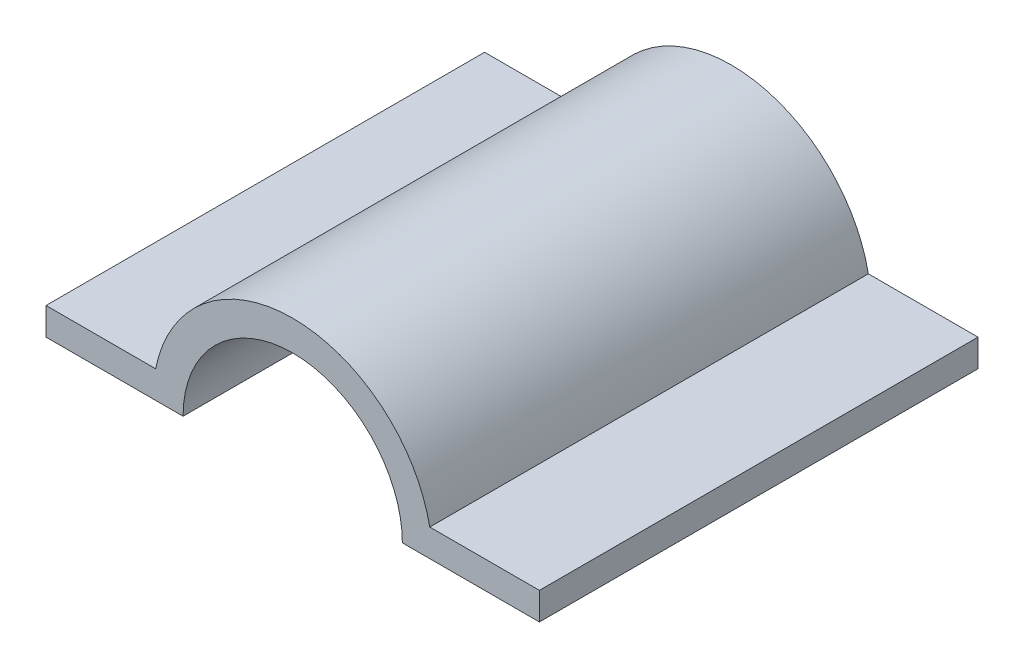
ISO-10303-21;
HEADER;
FILE_DESCRIPTION(('STEP AP214'),'2;1');
FILE_NAME('part.step','',(''),(''),'','','');
FILE_SCHEMA(('AUTOMOTIVE_DESIGN { 1 0 10303 214 1 1 1 1 }'));
ENDSEC;
DATA;
#1=APPLICATION_CONTEXT('core data for automotive mechanical design processes');
#2=APPLICATION_PROTOCOL_DEFINITION('international standard','automotive_design',2000,#1);
#3=PRODUCT_CONTEXT('',#1,'mechanical');
#4=PRODUCT('Part','Part','',(#3));
#5=PRODUCT_RELATED_PRODUCT_CATEGORY('part','',(#4));
#6=PRODUCT_DEFINITION_FORMATION('','',#4);
#7=PRODUCT_DEFINITION_CONTEXT('part definition',#1,'design');
#8=PRODUCT_DEFINITION('design','',#6,#7);
#9=PRODUCT_DEFINITION_SHAPE('','',#8);
#10=(LENGTH_UNIT() NAMED_UNIT(*) SI_UNIT(.MILLI.,.METRE.));
#11=(NAMED_UNIT(*) PLANE_ANGLE_UNIT() SI_UNIT($,.RADIAN.));
#12=(NAMED_UNIT(*) SI_UNIT($,.STERADIAN.) SOLID_ANGLE_UNIT());
#13=UNCERTAINTY_MEASURE_WITH_UNIT(LENGTH_MEASURE(1.E-05),#10,'distance_accuracy_value','');
#14=(GEOMETRIC_REPRESENTATION_CONTEXT(3) GLOBAL_UNCERTAINTY_ASSIGNED_CONTEXT((#13)) GLOBAL_UNIT_ASSIGNED_CONTEXT((#10,
#11,#12)) REPRESENTATION_CONTEXT('',''));
#15=CARTESIAN_POINT('',(0.,0.,0.));
#16=DIRECTION('',(0.,0.,1.));
#17=DIRECTION('',(1.,0.,0.));
#18=AXIS2_PLACEMENT_3D('',#15,#16,#17);
#19=CARTESIAN_POINT('',(0.,0.,101.6));
#20=DIRECTION('',(0.,0.,-1.));
#21=DIRECTION('',(-1.,0.,0.));
#22=AXIS2_PLACEMENT_3D('',#19,#20,#21);
#23=CYLINDRICAL_SURFACE('',#22,50.8);
#24=CARTESIAN_POINT('',(0.,0.,-8.19762623069123));
#25=DIRECTION('',(0.,0.,-1.));
#26=DIRECTION('',(-1.,0.,0.));
#27=AXIS2_PLACEMENT_3D('',#24,#25,#26);
#28=CIRCLE('',#27,50.8);
#29=CARTESIAN_POINT('',(-50.8,0.,-8.19762623069123));
#30=VERTEX_POINT('',#29);
#31=CARTESIAN_POINT('',(50.8,0.,-8.19762623069123));
#32=VERTEX_POINT('',#31);
#33=EDGE_CURVE('E147',#30,#32,#28,.T.);
#34=ORIENTED_EDGE('',*,*,#33,.F.);
#35=DIRECTION('',(0.,0.,-1.));
#36=VECTOR('',#35,1.);
#37=CARTESIAN_POINT('',(-50.8,0.,101.6));
#38=LINE('',#37,#36);
#39=CARTESIAN_POINT('',(-50.8,0.,-101.6));
#40=VERTEX_POINT('',#39);
#41=EDGE_CURVE('E92',#30,#40,#38,.T.);
#42=ORIENTED_EDGE('',*,*,#41,.T.);
#43=CARTESIAN_POINT('',(0.,0.,-101.6));
#44=DIRECTION('',(0.,0.,-1.));
#45=DIRECTION('',(1.,0.,0.));
#46=AXIS2_PLACEMENT_3D('',#43,#44,#45);
#47=CIRCLE('',#46,50.8);
#48=CARTESIAN_POINT('',(50.8,0.,-101.6));
#49=VERTEX_POINT('',#48);
#50=EDGE_CURVE('E144',#40,#49,#47,.T.);
#51=ORIENTED_EDGE('',*,*,#50,.T.);
#52=DIRECTION('',(0.,0.,-1.));
#53=VECTOR('',#52,1.);
#54=CARTESIAN_POINT('',(50.8,0.,101.6));
#55=LINE('',#54,#53);
#56=EDGE_CURVE('E175',#32,#49,#55,.T.);
#57=ORIENTED_EDGE('',*,*,#56,.F.);
#58=EDGE_LOOP('',(#34,#42,#51,#57));
#59=FACE_BOUND('',#58,.T.);
#60=ADVANCED_FACE('F32',(#59),#23,.F.);
#61=CARTESIAN_POINT('',(0.,0.,8.19762623069123));
#62=DIRECTION('',(0.,0.,-1.));
#63=DIRECTION('',(-1.,0.,0.));
#64=AXIS2_PLACEMENT_3D('',#61,#62,#63);
#65=CIRCLE('',#64,50.8);
#66=CARTESIAN_POINT('',(50.8,0.,8.19762623069123));
#67=VERTEX_POINT('',#66);
#68=CARTESIAN_POINT('',(-50.8,0.,8.19762623069123));
#69=VERTEX_POINT('',#68);
#70=EDGE_CURVE('E49',#67,#69,#65,.F.);
#71=ORIENTED_EDGE('',*,*,#70,.F.);
#72=CARTESIAN_POINT('',(50.8,0.,101.6));
#73=VERTEX_POINT('',#72);
#74=EDGE_CURVE('E41',#73,#67,#55,.T.);
#75=ORIENTED_EDGE('',*,*,#74,.F.);
#76=CARTESIAN_POINT('',(0.,0.,101.6));
#77=DIRECTION('',(0.,0.,-1.));
#78=DIRECTION('',(1.,0.,0.));
#79=AXIS2_PLACEMENT_3D('',#76,#77,#78);
#80=CIRCLE('',#79,50.8);
#81=CARTESIAN_POINT('',(-50.8,0.,101.6));
#82=VERTEX_POINT('',#81);
#83=EDGE_CURVE('E160',#82,#73,#80,.T.);
#84=ORIENTED_EDGE('',*,*,#83,.F.);
#85=EDGE_CURVE('E161',#82,#69,#38,.T.);
#86=ORIENTED_EDGE('',*,*,#85,.T.);
#87=EDGE_LOOP('',(#71,#75,#84,#86));
#88=FACE_BOUND('',#87,.T.);
#89=ADVANCED_FACE('F301',(#88),#23,.F.);
#90=CARTESIAN_POINT('',(50.8,0.,101.6));
#91=DIRECTION('',(0.,1.,0.));
#92=DIRECTION('',(-1.,0.,0.));
#93=AXIS2_PLACEMENT_3D('',#90,#91,#92);
#94=PLANE('',#93);
#95=DIRECTION('',(1.,0.,0.));
#96=VECTOR('',#95,1.);
#97=CARTESIAN_POINT('',(46.1063541234793,0.,-8.19762623069123));
#98=LINE('',#97,#96);
#99=CARTESIAN_POINT('',(55.4825973181627,0.,-8.19762623069123));
#100=VERTEX_POINT('',#99);
#101=EDGE_CURVE('E181',#100,#32,#98,.F.);
#102=ORIENTED_EDGE('',*,*,#101,.T.);
#103=ORIENTED_EDGE('',*,*,#56,.T.);
#104=DIRECTION('',(1.,0.,0.));
#105=VECTOR('',#104,1.);
#106=CARTESIAN_POINT('',(50.8,0.,-101.6));
#107=LINE('',#106,#105);
#108=CARTESIAN_POINT('',(114.3,0.,-101.6));
#109=VERTEX_POINT('',#108);
#110=EDGE_CURVE('E146',#49,#109,#107,.T.);
#111=ORIENTED_EDGE('',*,*,#110,.T.);
#112=DIRECTION('',(0.,0.,-1.));
#113=VECTOR('',#112,1.);
#114=CARTESIAN_POINT('',(114.3,0.,101.6));
#115=LINE('',#114,#113);
#116=CARTESIAN_POINT('',(114.3,0.,101.6));
#117=VERTEX_POINT('',#116);
#118=EDGE_CURVE('E172',#117,#109,#115,.T.);
#119=ORIENTED_EDGE('',*,*,#118,.F.);
#120=DIRECTION('',(1.,0.,0.));
#121=VECTOR('',#120,1.);
#122=CARTESIAN_POINT('',(50.8,0.,101.6));
#123=LINE('',#122,#121);
#124=EDGE_CURVE('E101',#73,#117,#123,.T.);
#125=ORIENTED_EDGE('',*,*,#124,.F.);
#126=ORIENTED_EDGE('',*,*,#74,.T.);
#127=DIRECTION('',(1.,0.,0.));
#128=VECTOR('',#127,1.);
#129=CARTESIAN_POINT('',(46.1063541234793,0.,8.19762623069123));
#130=LINE('',#129,#128);
#131=CARTESIAN_POINT('',(55.4825881307807,0.,8.19762623069123));
#132=VERTEX_POINT('',#131);
#133=EDGE_CURVE('E273',#67,#132,#130,.T.);
#134=ORIENTED_EDGE('',*,*,#133,.T.);
#135=DIRECTION('',(0.,0.,1.));
#136=VECTOR('',#135,1.);
#137=CARTESIAN_POINT('',(55.4825973181627,0.,0.));
#138=LINE('',#137,#136);
#139=EDGE_CURVE('E182',#132,#100,#138,.F.);
#140=ORIENTED_EDGE('',*,*,#139,.T.);
#141=EDGE_LOOP('',(#102,#103,#111,#119,#125,#126,#134,#140));
#142=FACE_BOUND('',#141,.T.);
#143=ADVANCED_FACE('F302',(#142),#94,.F.);
#144=CARTESIAN_POINT('',(-50.8,0.,101.6));
#145=DIRECTION('',(0.,1.,0.));
#146=DIRECTION('',(-1.,0.,0.));
#147=AXIS2_PLACEMENT_3D('',#144,#145,#146);
#148=PLANE('',#147);
#149=DIRECTION('',(-1.,0.,0.));
#150=VECTOR('',#149,1.);
#151=CARTESIAN_POINT('',(-50.8,0.,-8.19762623069123));
#152=LINE('',#151,#150);
#153=CARTESIAN_POINT('',(-55.482592724492,4.82991327054733E-09,-8.19762623069123));
#154=VERTEX_POINT('',#153);
#155=EDGE_CURVE('E11',#154,#30,#152,.F.);
#156=ORIENTED_EDGE('',*,*,#155,.F.);
#157=DIRECTION('',(0.,0.,1.));
#158=VECTOR('',#157,1.);
#159=CARTESIAN_POINT('',(-55.4825973172437,0.,0.));
#160=LINE('',#159,#158);
#161=CARTESIAN_POINT('',(-55.482591679733,0.,8.19762623069123));
#162=VERTEX_POINT('',#161);
#163=EDGE_CURVE('E191',#154,#162,#160,.T.);
#164=ORIENTED_EDGE('',*,*,#163,.T.);
#165=DIRECTION('',(1.,0.,0.));
#166=VECTOR('',#165,1.);
#167=CARTESIAN_POINT('',(46.1063541234793,0.,8.19762623069123));
#168=LINE('',#167,#166);
#169=EDGE_CURVE('E198',#162,#69,#168,.T.);
#170=ORIENTED_EDGE('',*,*,#169,.T.);
#171=ORIENTED_EDGE('',*,*,#85,.F.);
#172=DIRECTION('',(1.,0.,0.));
#173=VECTOR('',#172,1.);
#174=CARTESIAN_POINT('',(-50.8,0.,101.6));
#175=LINE('',#174,#173);
#176=CARTESIAN_POINT('',(-114.3,0.,101.6));
#177=VERTEX_POINT('',#176);
#178=EDGE_CURVE('E58',#177,#82,#175,.T.);
#179=ORIENTED_EDGE('',*,*,#178,.F.);
#180=DIRECTION('',(0.,0.,-1.));
#181=VECTOR('',#180,1.);
#182=CARTESIAN_POINT('',(-114.3,0.,101.6));
#183=LINE('',#182,#181);
#184=CARTESIAN_POINT('',(-114.3,0.,-101.6));
#185=VERTEX_POINT('',#184);
#186=EDGE_CURVE('E136',#177,#185,#183,.T.);
#187=ORIENTED_EDGE('',*,*,#186,.T.);
#188=DIRECTION('',(1.,0.,0.));
#189=VECTOR('',#188,1.);
#190=CARTESIAN_POINT('',(-50.8,0.,-101.6));
#191=LINE('',#190,#189);
#192=EDGE_CURVE('E158',#185,#40,#191,.T.);
#193=ORIENTED_EDGE('',*,*,#192,.T.);
#194=ORIENTED_EDGE('',*,*,#41,.F.);
#195=EDGE_LOOP('',(#156,#164,#170,#171,#179,#187,#193,#194));
#196=FACE_BOUND('',#195,.T.);
#197=ADVANCED_FACE('F297',(#196),#148,.F.);
#198=CARTESIAN_POINT('',(114.3,0.,101.6));
#199=DIRECTION('',(-1.,0.,0.));
#200=DIRECTION('',(0.,0.,1.));
#201=AXIS2_PLACEMENT_3D('',#198,#199,#200);
#202=PLANE('',#201);
#203=DIRECTION('',(0.,1.,0.));
#204=VECTOR('',#203,1.);
#205=CARTESIAN_POINT('',(114.3,0.,-101.6));
#206=LINE('',#205,#204);
#207=CARTESIAN_POINT('',(114.3,12.7,-101.6));
#208=VERTEX_POINT('',#207);
#209=EDGE_CURVE('E149',#109,#208,#206,.T.);
#210=ORIENTED_EDGE('',*,*,#209,.T.);
#211=DIRECTION('',(0.,0.,-1.));
#212=VECTOR('',#211,1.);
#213=CARTESIAN_POINT('',(114.3,12.7,101.6));
#214=LINE('',#213,#212);
#215=CARTESIAN_POINT('',(114.3,12.7,101.6));
#216=VERTEX_POINT('',#215);
#217=EDGE_CURVE('E169',#216,#208,#214,.T.);
#218=ORIENTED_EDGE('',*,*,#217,.F.);
#219=DIRECTION('',(0.,1.,0.));
#220=VECTOR('',#219,1.);
#221=CARTESIAN_POINT('',(114.3,0.,101.6));
#222=LINE('',#221,#220);
#223=EDGE_CURVE('E280',#117,#216,#222,.T.);
#224=ORIENTED_EDGE('',*,*,#223,.F.);
#225=ORIENTED_EDGE('',*,*,#118,.T.);
#226=EDGE_LOOP('',(#210,#218,#224,#225));
#227=FACE_BOUND('',#226,.T.);
#228=ADVANCED_FACE('F306',(#227),#202,.F.);
#229=CARTESIAN_POINT('',(114.3,12.7,101.6));
#230=DIRECTION('',(0.,-1.,0.));
#231=DIRECTION('',(1.,0.,0.));
#232=AXIS2_PLACEMENT_3D('',#229,#230,#231);
#233=PLANE('',#232);
#234=DIRECTION('',(-1.,0.,0.));
#235=VECTOR('',#234,1.);
#236=CARTESIAN_POINT('',(114.3,12.7,-101.6));
#237=LINE('',#236,#235);
#238=CARTESIAN_POINT('',(63.5,12.7,-101.6));
#239=VERTEX_POINT('',#238);
#240=EDGE_CURVE('E151',#208,#239,#237,.T.);
#241=ORIENTED_EDGE('',*,*,#240,.T.);
#242=DIRECTION('',(0.,0.,-1.));
#243=VECTOR('',#242,1.);
#244=CARTESIAN_POINT('',(63.5,12.7,101.6));
#245=LINE('',#244,#243);
#246=CARTESIAN_POINT('',(63.5,12.7,101.6));
#247=VERTEX_POINT('',#246);
#248=EDGE_CURVE('E166',#247,#239,#245,.T.);
#249=ORIENTED_EDGE('',*,*,#248,.F.);
#250=DIRECTION('',(-1.,0.,0.));
#251=VECTOR('',#250,1.);
#252=CARTESIAN_POINT('',(114.3,12.7,101.6));
#253=LINE('',#252,#251);
#254=EDGE_CURVE('E282',#216,#247,#253,.T.);
#255=ORIENTED_EDGE('',*,*,#254,.F.);
#256=ORIENTED_EDGE('',*,*,#217,.T.);
#257=EDGE_LOOP('',(#241,#249,#255,#256));
#258=FACE_BOUND('',#257,.T.);
#259=ADVANCED_FACE('F288',(#258),#233,.F.);
#260=CARTESIAN_POINT('',(0.,0.,101.6));
#261=DIRECTION('',(0.,0.,-1.));
#262=DIRECTION('',(-1.,0.,0.));
#263=AXIS2_PLACEMENT_3D('',#260,#261,#262);
#264=CYLINDRICAL_SURFACE('',#263,64.7575478226284);
#265=CARTESIAN_POINT('',(0.,0.,-101.6));
#266=DIRECTION('',(0.,0.,1.));
#267=DIRECTION('',(1.,0.,0.));
#268=AXIS2_PLACEMENT_3D('',#265,#266,#267);
#269=CIRCLE('',#268,64.7575478226284);
#270=CARTESIAN_POINT('',(-63.5,12.7,-101.6));
#271=VERTEX_POINT('',#270);
#272=EDGE_CURVE('E153',#239,#271,#269,.T.);
#273=ORIENTED_EDGE('',*,*,#272,.T.);
#274=DIRECTION('',(0.,0.,-1.));
#275=VECTOR('',#274,1.);
#276=CARTESIAN_POINT('',(-63.5,12.7,101.6));
#277=LINE('',#276,#275);
#278=CARTESIAN_POINT('',(-63.5,12.7,101.6));
#279=VERTEX_POINT('',#278);
#280=EDGE_CURVE('E135',#279,#271,#277,.T.);
#281=ORIENTED_EDGE('',*,*,#280,.F.);
#282=CARTESIAN_POINT('',(0.,0.,101.6));
#283=DIRECTION('',(0.,0.,1.));
#284=DIRECTION('',(1.,0.,0.));
#285=AXIS2_PLACEMENT_3D('',#282,#283,#284);
#286=CIRCLE('',#285,64.7575478226284);
#287=EDGE_CURVE('E123',#247,#279,#286,.T.);
#288=ORIENTED_EDGE('',*,*,#287,.F.);
#289=ORIENTED_EDGE('',*,*,#248,.T.);
#290=EDGE_LOOP('',(#273,#281,#288,#289));
#291=FACE_BOUND('',#290,.T.);
#292=ADVANCED_FACE('F292',(#291),#264,.T.);
#293=CARTESIAN_POINT('',(-114.3,12.7,101.6));
#294=DIRECTION('',(0.,-1.,0.));
#295=DIRECTION('',(0.,0.,-1.));
#296=AXIS2_PLACEMENT_3D('',#293,#294,#295);
#297=PLANE('',#296);
#298=DIRECTION('',(-1.,0.,0.));
#299=VECTOR('',#298,1.);
#300=CARTESIAN_POINT('',(-114.3,12.7,-101.6));
#301=LINE('',#300,#299);
#302=CARTESIAN_POINT('',(-114.3,12.7,-101.6));
#303=VERTEX_POINT('',#302);
#304=EDGE_CURVE('E132',#271,#303,#301,.T.);
#305=ORIENTED_EDGE('',*,*,#304,.T.);
#306=DIRECTION('',(0.,0.,-1.));
#307=VECTOR('',#306,1.);
#308=CARTESIAN_POINT('',(-114.3,12.7,101.6));
#309=LINE('',#308,#307);
#310=CARTESIAN_POINT('',(-114.3,12.7,101.6));
#311=VERTEX_POINT('',#310);
#312=EDGE_CURVE('E129',#311,#303,#309,.T.);
#313=ORIENTED_EDGE('',*,*,#312,.F.);
#314=DIRECTION('',(-1.,0.,0.));
#315=VECTOR('',#314,1.);
#316=CARTESIAN_POINT('',(-114.3,12.7,101.6));
#317=LINE('',#316,#315);
#318=EDGE_CURVE('E116',#279,#311,#317,.T.);
#319=ORIENTED_EDGE('',*,*,#318,.F.);
#320=ORIENTED_EDGE('',*,*,#280,.T.);
#321=EDGE_LOOP('',(#305,#313,#319,#320));
#322=FACE_BOUND('',#321,.T.);
#323=ADVANCED_FACE('F130',(#322),#297,.F.);
#324=CARTESIAN_POINT('',(-114.3,0.,101.6));
#325=DIRECTION('',(1.,0.,0.));
#326=DIRECTION('',(0.,0.,-1.));
#327=AXIS2_PLACEMENT_3D('',#324,#325,#326);
#328=PLANE('',#327);
#329=DIRECTION('',(0.,-1.,0.));
#330=VECTOR('',#329,1.);
#331=CARTESIAN_POINT('',(-114.3,0.,-101.6));
#332=LINE('',#331,#330);
#333=EDGE_CURVE('E156',#303,#185,#332,.T.);
#334=ORIENTED_EDGE('',*,*,#333,.T.);
#335=ORIENTED_EDGE('',*,*,#186,.F.);
#336=DIRECTION('',(0.,-1.,0.));
#337=VECTOR('',#336,1.);
#338=CARTESIAN_POINT('',(-114.3,0.,101.6));
#339=LINE('',#338,#337);
#340=EDGE_CURVE('E120',#311,#177,#339,.T.);
#341=ORIENTED_EDGE('',*,*,#340,.F.);
#342=ORIENTED_EDGE('',*,*,#312,.T.);
#343=EDGE_LOOP('',(#334,#335,#341,#342));
#344=FACE_BOUND('',#343,.T.);
#345=ADVANCED_FACE('F138',(#344),#328,.F.);
#346=CARTESIAN_POINT('',(0.,0.,101.6));
#347=DIRECTION('',(0.,0.,1.));
#348=DIRECTION('',(1.,0.,0.));
#349=AXIS2_PLACEMENT_3D('',#346,#347,#348);
#350=PLANE('',#349);
#351=ORIENTED_EDGE('',*,*,#83,.T.);
#352=ORIENTED_EDGE('',*,*,#124,.T.);
#353=ORIENTED_EDGE('',*,*,#223,.T.);
#354=ORIENTED_EDGE('',*,*,#254,.T.);
#355=ORIENTED_EDGE('',*,*,#287,.T.);
#356=ORIENTED_EDGE('',*,*,#318,.T.);
#357=ORIENTED_EDGE('',*,*,#340,.T.);
#358=ORIENTED_EDGE('',*,*,#178,.T.);
#359=EDGE_LOOP('',(#351,#352,#353,#354,#355,#356,#357,#358));
#360=FACE_BOUND('',#359,.T.);
#361=ADVANCED_FACE('F118',(#360),#350,.T.);
#362=CARTESIAN_POINT('',(0.,0.,-101.6));
#363=DIRECTION('',(0.,0.,1.));
#364=DIRECTION('',(1.,0.,0.));
#365=AXIS2_PLACEMENT_3D('',#362,#363,#364);
#366=PLANE('',#365);
#367=ORIENTED_EDGE('',*,*,#50,.F.);
#368=ORIENTED_EDGE('',*,*,#192,.F.);
#369=ORIENTED_EDGE('',*,*,#333,.F.);
#370=ORIENTED_EDGE('',*,*,#304,.F.);
#371=ORIENTED_EDGE('',*,*,#272,.F.);
#372=ORIENTED_EDGE('',*,*,#240,.F.);
#373=ORIENTED_EDGE('',*,*,#209,.F.);
#374=ORIENTED_EDGE('',*,*,#110,.F.);
#375=EDGE_LOOP('',(#367,#368,#369,#370,#371,#372,#373,#374));
#376=FACE_BOUND('',#375,.T.);
#377=ADVANCED_FACE('F231',(#376),#366,.F.);
#378=CARTESIAN_POINT('',(46.1063541234793,-1.00089578952663,-8.19762623069123));
#379=DIRECTION('',(0.,0.,-1.));
#380=DIRECTION('',(-1.,0.,0.));
#381=AXIS2_PLACEMENT_3D('',#378,#379,#380);
#382=PLANE('',#381);
#383=ORIENTED_EDGE('',*,*,#33,.T.);
#384=ORIENTED_EDGE('',*,*,#101,.F.);
#385=CARTESIAN_POINT('',(55.4717794164297,-1.18192783074056,-8.19762623069123));
#386=CARTESIAN_POINT('',(55.5352174768865,2.09994650252672,-8.19762623069123));
#387=CARTESIAN_POINT('',(55.3238227897489,5.49996448349898,-8.19762623069123));
#388=CARTESIAN_POINT('',(54.1753030721974,12.4904584132783,-8.19762623069123));
#389=CARTESIAN_POINT('',(53.2599778800917,15.9908811448254,-8.19762623069123));
#390=CARTESIAN_POINT('',(50.6412282465828,22.973888146902,-8.19762623069123));
#391=CARTESIAN_POINT('',(48.9704317530343,26.3671845510343,-8.19762623069123));
#392=CARTESIAN_POINT('',(44.8470732022313,32.8948576387515,-8.19762623069123));
#393=CARTESIAN_POINT('',(42.4434681271894,35.946208716517,-8.19762623069123));
#394=CARTESIAN_POINT('',(37.0091458836727,41.5198871408076,-8.19762623069123));
#395=CARTESIAN_POINT('',(34.0162768986601,44.0034846435391,-8.19762623069123));
#396=CARTESIAN_POINT('',(27.5762222601085,48.3007835563245,-8.19762623069123));
#397=CARTESIAN_POINT('',(24.2037655838334,50.0657868147672,-8.19762623069123));
#398=CARTESIAN_POINT('',(13.8008384789187,54.2574641196469,-8.19762623069123));
#399=CARTESIAN_POINT('',(6.65677252300107,55.4835873942359,-8.19762623069123));
#400=CARTESIAN_POINT('',(-6.65678557871004,55.4835873942359,-8.19762623069123));
#401=CARTESIAN_POINT('',(-13.8008594363077,54.2574592658636,-8.19762623069123));
#402=CARTESIAN_POINT('',(-24.2037894892732,50.0657753871628,-8.19762623069123));
#403=CARTESIAN_POINT('',(-27.5762457644362,48.3007700997258,-8.19762623069123));
#404=CARTESIAN_POINT('',(-34.0162975717791,44.003468621536,-8.19762623069123));
#405=CARTESIAN_POINT('',(-37.0091643606415,41.5198704892197,-8.19762623069123));
#406=CARTESIAN_POINT('',(-42.4434815958238,35.9461926032845,-8.19762623069123));
#407=CARTESIAN_POINT('',(-44.8470840961663,32.8948424630055,-8.19762623069123));
#408=CARTESIAN_POINT('',(-48.970437832283,26.367172856592,-8.19762623069123));
#409=CARTESIAN_POINT('',(-50.6412325203868,22.9738783194162,-8.19762623069123));
#410=CARTESIAN_POINT('',(-53.2599793621227,15.9908756241304,-8.19762623069123));
#411=CARTESIAN_POINT('',(-54.1753038360816,12.490454656932,-8.19762623069123));
#412=CARTESIAN_POINT('',(-55.3238227612217,5.49996376407798,-8.19762623069123));
#413=CARTESIAN_POINT('',(-55.5352174753948,2.09994642592592,-8.19762623069123));
#414=CARTESIAN_POINT('',(-55.4717794164298,-1.18192783074031,-8.19762623069123));
#415=B_SPLINE_CURVE_WITH_KNOTS('',3,(#385,#386,#387,#388,#389,#390,#391,#392,#393,#394,#395,
#396,#397,#398,#399,#400,#401,#402,#403,#404,#405,#406,#407,#408,#409,#410,#411,#412,#413,#414),
.UNSPECIFIED.,.F.,.F.,(4,2,2,2,2,2,2,2,2,2,2,2,2,2,4),(0.,0.0624999387104631,0.124999877420926,
0.187499816131389,0.249999754841853,0.312499693552316,0.374999632262779,0.499999509683705,
0.624999632262779,0.687499693552316,0.749999754841853,0.812499816131389,0.874999877420926,
0.937499938710463,1.),.UNSPECIFIED.);
#416=EDGE_CURVE('E178',#100,#154,#415,.T.);
#417=ORIENTED_EDGE('',*,*,#416,.T.);
#418=ORIENTED_EDGE('',*,*,#155,.T.);
#419=EDGE_LOOP('',(#383,#384,#417,#418));
#420=FACE_BOUND('',#419,.T.);
#421=ADVANCED_FACE('F222',(#420),#382,.F.);
#422=CARTESIAN_POINT('',(46.1063541234793,-1.00089578952663,8.19762623069123));
#423=DIRECTION('',(0.,0.,-1.));
#424=DIRECTION('',(-1.,0.,0.));
#425=AXIS2_PLACEMENT_3D('',#422,#423,#424);
#426=PLANE('',#425);
#427=ORIENTED_EDGE('',*,*,#70,.T.);
#428=ORIENTED_EDGE('',*,*,#169,.F.);
#429=CARTESIAN_POINT('',(55.4717794164297,-1.18192783074056,8.19762623069123));
#430=CARTESIAN_POINT('',(55.5352174768865,2.09994650252672,8.19762623069123));
#431=CARTESIAN_POINT('',(55.3238227897489,5.49996448349898,8.19762623069123));
#432=CARTESIAN_POINT('',(54.1753030721974,12.4904584132783,8.19762623069123));
#433=CARTESIAN_POINT('',(53.2599778800917,15.9908811448254,8.19762623069123));
#434=CARTESIAN_POINT('',(50.6412282465828,22.973888146902,8.19762623069123));
#435=CARTESIAN_POINT('',(48.9704317530343,26.3671845510343,8.19762623069123));
#436=CARTESIAN_POINT('',(44.8470732022313,32.8948576387515,8.19762623069123));
#437=CARTESIAN_POINT('',(42.4434681271894,35.946208716517,8.19762623069123));
#438=CARTESIAN_POINT('',(37.0091458836727,41.5198871408076,8.19762623069123));
#439=CARTESIAN_POINT('',(34.0162768986601,44.0034846435391,8.19762623069123));
#440=CARTESIAN_POINT('',(27.5762222601085,48.3007835563245,8.19762623069123));
#441=CARTESIAN_POINT('',(24.2037655838334,50.0657868147672,8.19762623069123));
#442=CARTESIAN_POINT('',(13.8008384789187,54.2574641196469,8.19762623069123));
#443=CARTESIAN_POINT('',(6.65677252300107,55.4835873942359,8.19762623069123));
#444=CARTESIAN_POINT('',(-6.65678557871004,55.4835873942359,8.19762623069123));
#445=CARTESIAN_POINT('',(-13.8008594363077,54.2574592658636,8.19762623069123));
#446=CARTESIAN_POINT('',(-24.2037894892732,50.0657753871628,8.19762623069123));
#447=CARTESIAN_POINT('',(-27.5762457644362,48.3007700997258,8.19762623069123));
#448=CARTESIAN_POINT('',(-34.0162975717791,44.003468621536,8.19762623069123));
#449=CARTESIAN_POINT('',(-37.0091643606415,41.5198704892197,8.19762623069123));
#450=CARTESIAN_POINT('',(-42.4434815958238,35.9461926032845,8.19762623069123));
#451=CARTESIAN_POINT('',(-44.8470840961663,32.8948424630055,8.19762623069123));
#452=CARTESIAN_POINT('',(-48.970437832283,26.367172856592,8.19762623069123));
#453=CARTESIAN_POINT('',(-50.6412325203868,22.9738783194162,8.19762623069123));
#454=CARTESIAN_POINT('',(-53.2599793621227,15.9908756241304,8.19762623069123));
#455=CARTESIAN_POINT('',(-54.1753038360816,12.490454656932,8.19762623069123));
#456=CARTESIAN_POINT('',(-55.3238227612217,5.49996376407798,8.19762623069123));
#457=CARTESIAN_POINT('',(-55.5352174753948,2.09994642592592,8.19762623069123));
#458=CARTESIAN_POINT('',(-55.4717794164298,-1.18192783074031,8.19762623069123));
#459=B_SPLINE_CURVE_WITH_KNOTS('',3,(#429,#430,#431,#432,#433,#434,#435,#436,#437,#438,#439,
#440,#441,#442,#443,#444,#445,#446,#447,#448,#449,#450,#451,#452,#453,#454,#455,#456,#457,#458),
.UNSPECIFIED.,.F.,.F.,(4,2,2,2,2,2,2,2,2,2,2,2,2,2,4),(0.,0.0624999387104631,0.124999877420926,
0.187499816131389,0.249999754841853,0.312499693552316,0.374999632262779,0.499999509683705,
0.624999632262779,0.687499693552316,0.749999754841853,0.812499816131389,0.874999877420926,
0.937499938710463,1.),.UNSPECIFIED.);
#460=EDGE_CURVE('E35',#132,#162,#459,.T.);
#461=ORIENTED_EDGE('',*,*,#460,.F.);
#462=ORIENTED_EDGE('',*,*,#133,.F.);
#463=EDGE_LOOP('',(#427,#428,#461,#462));
#464=FACE_BOUND('',#463,.T.);
#465=ADVANCED_FACE('F230',(#464),#426,.T.);
#466=CARTESIAN_POINT('',(55.4717794164297,-1.18192783074056,-8.19762623069123));
#467=CARTESIAN_POINT('',(55.5352174768865,2.09994650252672,-8.19762623069123));
#468=CARTESIAN_POINT('',(55.3238227897489,5.49996448349898,-8.19762623069123));
#469=CARTESIAN_POINT('',(54.1753030721974,12.4904584132783,-8.19762623069123));
#470=CARTESIAN_POINT('',(53.2599778800917,15.9908811448254,-8.19762623069123));
#471=CARTESIAN_POINT('',(50.6412282465828,22.973888146902,-8.19762623069123));
#472=CARTESIAN_POINT('',(48.9704317530343,26.3671845510343,-8.19762623069123));
#473=CARTESIAN_POINT('',(44.8470732022313,32.8948576387515,-8.19762623069123));
#474=CARTESIAN_POINT('',(42.4434681271894,35.946208716517,-8.19762623069123));
#475=CARTESIAN_POINT('',(37.0091458836727,41.5198871408076,-8.19762623069123));
#476=CARTESIAN_POINT('',(34.0162768986601,44.0034846435391,-8.19762623069123));
#477=CARTESIAN_POINT('',(27.5762222601085,48.3007835563245,-8.19762623069123));
#478=CARTESIAN_POINT('',(24.2037655838334,50.0657868147672,-8.19762623069123));
#479=CARTESIAN_POINT('',(13.8008384789187,54.2574641196469,-8.19762623069123));
#480=CARTESIAN_POINT('',(6.65677252300107,55.4835873942359,-8.19762623069123));
#481=CARTESIAN_POINT('',(-6.65678557871004,55.4835873942359,-8.19762623069123));
#482=CARTESIAN_POINT('',(-13.8008594363077,54.2574592658636,-8.19762623069123));
#483=CARTESIAN_POINT('',(-24.2037894892732,50.0657753871628,-8.19762623069123));
#484=CARTESIAN_POINT('',(-27.5762457644362,48.3007700997258,-8.19762623069123));
#485=CARTESIAN_POINT('',(-34.0162975717791,44.003468621536,-8.19762623069123));
#486=CARTESIAN_POINT('',(-37.0091643606415,41.5198704892197,-8.19762623069123));
#487=CARTESIAN_POINT('',(-42.4434815958238,35.9461926032845,-8.19762623069123));
#488=CARTESIAN_POINT('',(-44.8470840961663,32.8948424630055,-8.19762623069123));
#489=CARTESIAN_POINT('',(-48.970437832283,26.367172856592,-8.19762623069123));
#490=CARTESIAN_POINT('',(-50.6412325203868,22.9738783194162,-8.19762623069123));
#491=CARTESIAN_POINT('',(-53.2599793621227,15.9908756241304,-8.19762623069123));
#492=CARTESIAN_POINT('',(-54.1753038360816,12.490454656932,-8.19762623069123));
#493=CARTESIAN_POINT('',(-55.3238227612217,5.49996376407798,-8.19762623069123));
#494=CARTESIAN_POINT('',(-55.5352174753948,2.09994642592592,-8.19762623069123));
#495=CARTESIAN_POINT('',(-55.4717794164298,-1.18192783074031,-8.19762623069123));
#496=CARTESIAN_POINT('',(55.4717794164297,-1.18192783074056,8.19762623069123));
#497=CARTESIAN_POINT('',(55.5352174768865,2.09994650252672,8.19762623069123));
#498=CARTESIAN_POINT('',(55.3238227897489,5.49996448349898,8.19762623069123));
#499=CARTESIAN_POINT('',(54.1753030721974,12.4904584132783,8.19762623069123));
#500=CARTESIAN_POINT('',(53.2599778800917,15.9908811448254,8.19762623069123));
#501=CARTESIAN_POINT('',(50.6412282465828,22.973888146902,8.19762623069123));
#502=CARTESIAN_POINT('',(48.9704317530343,26.3671845510343,8.19762623069123));
#503=CARTESIAN_POINT('',(44.8470732022313,32.8948576387515,8.19762623069123));
#504=CARTESIAN_POINT('',(42.4434681271894,35.946208716517,8.19762623069123));
#505=CARTESIAN_POINT('',(37.0091458836727,41.5198871408076,8.19762623069123));
#506=CARTESIAN_POINT('',(34.0162768986601,44.0034846435391,8.19762623069123));
#507=CARTESIAN_POINT('',(27.5762222601085,48.3007835563245,8.19762623069123));
#508=CARTESIAN_POINT('',(24.2037655838334,50.0657868147672,8.19762623069123));
#509=CARTESIAN_POINT('',(13.8008384789187,54.2574641196469,8.19762623069123));
#510=CARTESIAN_POINT('',(6.65677252300107,55.4835873942359,8.19762623069123));
#511=CARTESIAN_POINT('',(-6.65678557871004,55.4835873942359,8.19762623069123));
#512=CARTESIAN_POINT('',(-13.8008594363077,54.2574592658636,8.19762623069123));
#513=CARTESIAN_POINT('',(-24.2037894892732,50.0657753871628,8.19762623069123));
#514=CARTESIAN_POINT('',(-27.5762457644362,48.3007700997258,8.19762623069123));
#515=CARTESIAN_POINT('',(-34.0162975717791,44.003468621536,8.19762623069123));
#516=CARTESIAN_POINT('',(-37.0091643606415,41.5198704892197,8.19762623069123));
#517=CARTESIAN_POINT('',(-42.4434815958238,35.9461926032845,8.19762623069123));
#518=CARTESIAN_POINT('',(-44.8470840961663,32.8948424630055,8.19762623069123));
#519=CARTESIAN_POINT('',(-48.970437832283,26.367172856592,8.19762623069123));
#520=CARTESIAN_POINT('',(-50.6412325203868,22.9738783194162,8.19762623069123));
#521=CARTESIAN_POINT('',(-53.2599793621227,15.9908756241304,8.19762623069123));
#522=CARTESIAN_POINT('',(-54.1753038360816,12.490454656932,8.19762623069123));
#523=CARTESIAN_POINT('',(-55.3238227612217,5.49996376407798,8.19762623069123));
#524=CARTESIAN_POINT('',(-55.5352174753948,2.09994642592592,8.19762623069123));
#525=CARTESIAN_POINT('',(-55.4717794164298,-1.18192783074031,8.19762623069123));
#526=B_SPLINE_SURFACE_WITH_KNOTS('',1,3,((#466,#467,#468,#469,#470,#471,#472,#473,#474,#475,
#476,#477,#478,#479,#480,#481,#482,#483,#484,#485,#486,#487,#488,#489,#490,#491,#492,#493,#494,
#495),(#496,#497,#498,#499,#500,#501,#502,#503,#504,#505,#506,#507,#508,#509,#510,#511,#512,
#513,#514,#515,#516,#517,#518,#519,#520,#521,#522,#523,#524,#525)),.UNSPECIFIED.,.F.,.F.,.F.,(2,
2),(4,2,2,2,2,2,2,2,2,2,2,2,2,2,4),(0.,1.),(0.,0.0624999387104631,0.124999877420926,
0.187499816131389,0.249999754841853,0.312499693552316,0.374999632262779,0.499999509683705,
0.624999632262779,0.687499693552316,0.749999754841853,0.812499816131389,0.874999877420926,
0.937499938710463,1.),.UNSPECIFIED.);
#527=ORIENTED_EDGE('',*,*,#416,.F.);
#528=ORIENTED_EDGE('',*,*,#139,.F.);
#529=ORIENTED_EDGE('',*,*,#460,.T.);
#530=ORIENTED_EDGE('',*,*,#163,.F.);
#531=EDGE_LOOP('',(#527,#528,#529,#530));
#532=FACE_BOUND('',#531,.T.);
#533=ADVANCED_FACE('F232',(#532),#526,.T.);
#534=CLOSED_SHELL('',(#60,#89,#143,#197,#228,#259,#292,#323,#345,#361,#377,#421,#465,#533));
#535=MANIFOLD_SOLID_BREP('B2',#534);
#536=ADVANCED_BREP_SHAPE_REPRESENTATION('',(#18,#535),#14);
#537=SHAPE_DEFINITION_REPRESENTATION(#9,#536);
ENDSEC;
END-ISO-10303-21;
